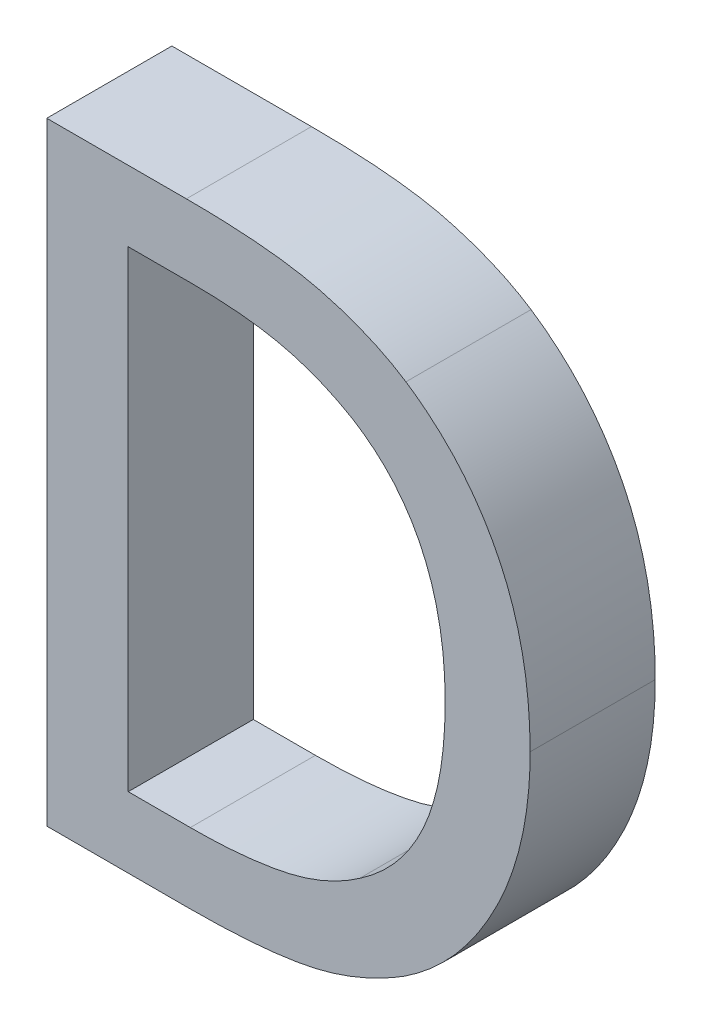
ISO-10303-21;
HEADER;
FILE_DESCRIPTION(('STEP AP214'),'2;1');
FILE_NAME('part.step','',(''),(''),'','','');
FILE_SCHEMA(('AUTOMOTIVE_DESIGN { 1 0 10303 214 1 1 1 1 }'));
ENDSEC;
DATA;
#1=APPLICATION_CONTEXT('core data for automotive mechanical design processes');
#2=APPLICATION_PROTOCOL_DEFINITION('international standard','automotive_design',2000,#1);
#3=PRODUCT_CONTEXT('',#1,'mechanical');
#4=PRODUCT('Part','Part','',(#3));
#5=PRODUCT_RELATED_PRODUCT_CATEGORY('part','',(#4));
#6=PRODUCT_DEFINITION_FORMATION('','',#4);
#7=PRODUCT_DEFINITION_CONTEXT('part definition',#1,'design');
#8=PRODUCT_DEFINITION('design','',#6,#7);
#9=PRODUCT_DEFINITION_SHAPE('','',#8);
#10=(LENGTH_UNIT() NAMED_UNIT(*) SI_UNIT(.MILLI.,.METRE.));
#11=(NAMED_UNIT(*) PLANE_ANGLE_UNIT() SI_UNIT($,.RADIAN.));
#12=(NAMED_UNIT(*) SI_UNIT($,.STERADIAN.) SOLID_ANGLE_UNIT());
#13=UNCERTAINTY_MEASURE_WITH_UNIT(LENGTH_MEASURE(1.E-05),#10,'distance_accuracy_value','');
#14=(GEOMETRIC_REPRESENTATION_CONTEXT(3) GLOBAL_UNCERTAINTY_ASSIGNED_CONTEXT((#13)) GLOBAL_UNIT_ASSIGNED_CONTEXT((#10,
#11,#12)) REPRESENTATION_CONTEXT('',''));
#15=CARTESIAN_POINT('',(0.,0.,0.));
#16=DIRECTION('',(0.,0.,1.));
#17=DIRECTION('',(1.,0.,0.));
#18=AXIS2_PLACEMENT_3D('',#15,#16,#17);
#19=CARTESIAN_POINT('',(-0.375230190296568,-1.23808482726,0.));
#20=CARTESIAN_POINT('',(-0.375230190296568,-1.23808482726,0.1));
#21=CARTESIAN_POINT('',(-0.34108108259972,-1.215054033697,0.));
#22=CARTESIAN_POINT('',(-0.34108108259972,-1.215054033697,0.1));
#23=CARTESIAN_POINT('',(-0.306931974902873,-1.13881416535,0.));
#24=CARTESIAN_POINT('',(-0.306931974902873,-1.13881416535,0.1));
#25=CARTESIAN_POINT('',(-0.306931974902873,-1.08163426409,0.));
#26=CARTESIAN_POINT('',(-0.306931974902873,-1.08163426409,0.1));
#27=B_SPLINE_SURFACE_WITH_KNOTS('',2,1,((#19,#20),(#21,#22),(#23,#24),(#25,#26)),.UNSPECIFIED.,
.F.,.F.,.F.,(3,1,3),(2,2),(0.,1.,2.),(0.,0.01),.UNSPECIFIED.);
#28=CARTESIAN_POINT('',(-0.375230190296568,-1.23808482726,0.));
#29=CARTESIAN_POINT('',(-0.34108108259972,-1.215054033697,0.));
#30=CARTESIAN_POINT('',(-0.306931974902873,-1.13881416535,0.));
#31=CARTESIAN_POINT('',(-0.306931974902873,-1.08163426409,0.));
#32=B_SPLINE_CURVE_WITH_KNOTS('',2,(#28,#29,#30,#31),.UNSPECIFIED.,.F.,.F.,(3,1,3),(0.,1.,2.),.UNSPECIFIED.);
#33=CARTESIAN_POINT('',(-0.375230190296568,-1.23808482726,0.));
#34=VERTEX_POINT('',#33);
#35=CARTESIAN_POINT('',(-0.306931974902873,-1.08163426409,0.));
#36=VERTEX_POINT('',#35);
#37=EDGE_CURVE('E11',#34,#36,#32,.T.);
#38=DIRECTION('',(0.,0.,1.));
#39=VECTOR('',#38,1.);
#40=CARTESIAN_POINT('',(-0.375230190296568,-1.23808482726,0.));
#41=LINE('',#40,#39);
#42=CARTESIAN_POINT('',(-0.375230190296568,-1.23808482726,0.1));
#43=VERTEX_POINT('',#42);
#44=EDGE_CURVE('E28',#34,#43,#41,.T.);
#45=CARTESIAN_POINT('',(-0.306931974902873,-1.08163426409,0.1));
#46=CARTESIAN_POINT('',(-0.306931974902873,-1.13881416535,0.1));
#47=CARTESIAN_POINT('',(-0.34108108259972,-1.215054033697,0.1));
#48=CARTESIAN_POINT('',(-0.375230190296568,-1.23808482726,0.1));
#49=B_SPLINE_CURVE_WITH_KNOTS('',2,(#45,#46,#47,#48),.UNSPECIFIED.,.F.,.F.,(3,1,3),(-2.,-1.,0.),.UNSPECIFIED.);
#50=CARTESIAN_POINT('',(-0.306931974902873,-1.08163426409,0.1));
#51=VERTEX_POINT('',#50);
#52=EDGE_CURVE('E305',#51,#43,#49,.T.);
#53=DIRECTION('',(0.,0.,1.));
#54=VECTOR('',#53,1.);
#55=CARTESIAN_POINT('',(-0.306931974902873,-1.08163426409,0.));
#56=LINE('',#55,#54);
#57=EDGE_CURVE('E41',#36,#51,#56,.T.);
#58=ORIENTED_EDGE('',*,*,#37,.F.);
#59=ORIENTED_EDGE('',*,*,#44,.T.);
#60=ORIENTED_EDGE('',*,*,#52,.F.);
#61=ORIENTED_EDGE('',*,*,#57,.F.);
#62=EDGE_LOOP('',(#58,#59,#60,#61));
#63=FACE_BOUND('',#62,.T.);
#64=ADVANCED_FACE('F17',(#63),#27,.F.);
#65=CARTESIAN_POINT('',(-0.510635373141046,-1.270645604366,0.));
#66=CARTESIAN_POINT('',(-0.510635373141046,-1.270645604366,0.1));
#67=CARTESIAN_POINT('',(-0.467353364548529,-1.270645604366,0.));
#68=CARTESIAN_POINT('',(-0.467353364548529,-1.270645604366,0.1));
#69=CARTESIAN_POINT('',(-0.401834727688298,-1.256747711699,0.));
#70=CARTESIAN_POINT('',(-0.401834727688298,-1.256747711699,0.1));
#71=CARTESIAN_POINT('',(-0.375230190296568,-1.23808482726,0.));
#72=CARTESIAN_POINT('',(-0.375230190296568,-1.23808482726,0.1));
#73=B_SPLINE_SURFACE_WITH_KNOTS('',2,1,((#65,#66),(#67,#68),(#69,#70),(#71,#72)),.UNSPECIFIED.,
.F.,.F.,.F.,(3,1,3),(2,2),(0.,1.,2.),(0.,0.01),.UNSPECIFIED.);
#74=CARTESIAN_POINT('',(-0.510635373141046,-1.270645604366,0.));
#75=CARTESIAN_POINT('',(-0.467353364548529,-1.270645604366,0.));
#76=CARTESIAN_POINT('',(-0.401834727688298,-1.256747711699,0.));
#77=CARTESIAN_POINT('',(-0.375230190296568,-1.23808482726,0.));
#78=B_SPLINE_CURVE_WITH_KNOTS('',2,(#74,#75,#76,#77),.UNSPECIFIED.,.F.,.F.,(3,1,3),(0.,1.,2.),.UNSPECIFIED.);
#79=CARTESIAN_POINT('',(-0.510635373141046,-1.270645604366,0.));
#80=VERTEX_POINT('',#79);
#81=EDGE_CURVE('E296',#80,#34,#78,.T.);
#82=DIRECTION('',(0.,0.,1.));
#83=VECTOR('',#82,1.);
#84=CARTESIAN_POINT('',(-0.510635373141046,-1.270645604366,0.));
#85=LINE('',#84,#83);
#86=CARTESIAN_POINT('',(-0.510635373141046,-1.270645604366,0.1));
#87=VERTEX_POINT('',#86);
#88=EDGE_CURVE('E290',#80,#87,#85,.T.);
#89=CARTESIAN_POINT('',(-0.375230190296568,-1.23808482726,0.1));
#90=CARTESIAN_POINT('',(-0.401834727688298,-1.256747711699,0.1));
#91=CARTESIAN_POINT('',(-0.467353364548529,-1.270645604366,0.1));
#92=CARTESIAN_POINT('',(-0.510635373141046,-1.270645604366,0.1));
#93=B_SPLINE_CURVE_WITH_KNOTS('',2,(#89,#90,#91,#92),.UNSPECIFIED.,.F.,.F.,(3,1,3),(-2.,-1.,0.),.UNSPECIFIED.);
#94=EDGE_CURVE('E286',#43,#87,#93,.T.);
#95=ORIENTED_EDGE('',*,*,#81,.F.);
#96=ORIENTED_EDGE('',*,*,#88,.T.);
#97=ORIENTED_EDGE('',*,*,#94,.F.);
#98=ORIENTED_EDGE('',*,*,#44,.F.);
#99=EDGE_LOOP('',(#95,#96,#97,#98));
#100=FACE_BOUND('',#99,.T.);
#101=ADVANCED_FACE('F311',(#100),#73,.F.);
#102=CARTESIAN_POINT('',(-0.560270704095766,-1.270645604366,0.));
#103=DIRECTION('',(0.,-1.,0.));
#104=DIRECTION('',(1.,0.,0.));
#105=AXIS2_PLACEMENT_3D('',#102,#103,#104);
#106=PLANE('',#105);
#107=DIRECTION('',(1.,0.,0.));
#108=VECTOR('',#107,1.);
#109=CARTESIAN_POINT('',(-0.520641165546713,-1.270645604366,0.));
#110=LINE('',#109,#108);
#111=CARTESIAN_POINT('',(-0.560270704095766,-1.270645604366,0.));
#112=VERTEX_POINT('',#111);
#113=EDGE_CURVE('E283',#112,#80,#110,.T.);
#114=ORIENTED_EDGE('',*,*,#113,.F.);
#115=DIRECTION('',(0.,0.,1.));
#116=VECTOR('',#115,1.);
#117=CARTESIAN_POINT('',(-0.560270704095766,-1.270645604366,0.));
#118=LINE('',#117,#116);
#119=CARTESIAN_POINT('',(-0.560270704095766,-1.270645604366,0.1));
#120=VERTEX_POINT('',#119);
#121=EDGE_CURVE('E281',#112,#120,#118,.T.);
#122=ORIENTED_EDGE('',*,*,#121,.T.);
#123=DIRECTION('',(-1.,0.,0.));
#124=VECTOR('',#123,1.);
#125=CARTESIAN_POINT('',(-0.520641165546713,-1.270645604366,0.1));
#126=LINE('',#125,#124);
#127=EDGE_CURVE('E278',#87,#120,#126,.T.);
#128=ORIENTED_EDGE('',*,*,#127,.F.);
#129=ORIENTED_EDGE('',*,*,#88,.F.);
#130=EDGE_LOOP('',(#114,#122,#128,#129));
#131=FACE_BOUND('',#130,.T.);
#132=ADVANCED_FACE('F324',(#131),#106,.F.);
#133=CARTESIAN_POINT('',(-0.560270704095766,-0.893417089109979,0.));
#134=DIRECTION('',(-1.,0.,0.));
#135=DIRECTION('',(0.,-1.,0.));
#136=AXIS2_PLACEMENT_3D('',#133,#134,#135);
#137=PLANE('',#136);
#138=DIRECTION('',(0.,-1.,0.));
#139=VECTOR('',#138,1.);
#140=CARTESIAN_POINT('',(-0.560270704095766,-0.987668539051488,0.));
#141=LINE('',#140,#139);
#142=CARTESIAN_POINT('',(-0.560270704095766,-0.893417089109979,0.));
#143=VERTEX_POINT('',#142);
#144=EDGE_CURVE('E275',#143,#112,#141,.T.);
#145=ORIENTED_EDGE('',*,*,#144,.F.);
#146=DIRECTION('',(0.,0.,1.));
#147=VECTOR('',#146,1.);
#148=CARTESIAN_POINT('',(-0.560270704095766,-0.893417089109979,0.));
#149=LINE('',#148,#147);
#150=CARTESIAN_POINT('',(-0.560270704095766,-0.893417089109979,0.1));
#151=VERTEX_POINT('',#150);
#152=EDGE_CURVE('E273',#143,#151,#149,.T.);
#153=ORIENTED_EDGE('',*,*,#152,.T.);
#154=DIRECTION('',(0.,1.,0.));
#155=VECTOR('',#154,1.);
#156=CARTESIAN_POINT('',(-0.560270704095766,-0.987668539051488,0.1));
#157=LINE('',#156,#155);
#158=EDGE_CURVE('E270',#120,#151,#157,.T.);
#159=ORIENTED_EDGE('',*,*,#158,.F.);
#160=ORIENTED_EDGE('',*,*,#121,.F.);
#161=EDGE_LOOP('',(#145,#153,#159,#160));
#162=FACE_BOUND('',#161,.T.);
#163=ADVANCED_FACE('F326',(#162),#137,.F.);
#164=CARTESIAN_POINT('',(-0.510635373141046,-0.893417089109979,0.));
#165=DIRECTION('',(0.,1.,0.));
#166=DIRECTION('',(-1.,0.,0.));
#167=AXIS2_PLACEMENT_3D('',#164,#165,#166);
#168=PLANE('',#167);
#169=DIRECTION('',(-1.,0.,0.));
#170=VECTOR('',#169,1.);
#171=CARTESIAN_POINT('',(-0.495823500069353,-0.893417089109979,0.));
#172=LINE('',#171,#170);
#173=CARTESIAN_POINT('',(-0.510635373141046,-0.893417089109979,0.));
#174=VERTEX_POINT('',#173);
#175=EDGE_CURVE('E267',#174,#143,#172,.T.);
#176=ORIENTED_EDGE('',*,*,#175,.F.);
#177=DIRECTION('',(0.,0.,1.));
#178=VECTOR('',#177,1.);
#179=CARTESIAN_POINT('',(-0.510635373141046,-0.893417089109979,0.));
#180=LINE('',#179,#178);
#181=CARTESIAN_POINT('',(-0.510635373141046,-0.893417089109979,0.1));
#182=VERTEX_POINT('',#181);
#183=EDGE_CURVE('E265',#174,#182,#180,.T.);
#184=ORIENTED_EDGE('',*,*,#183,.T.);
#185=DIRECTION('',(1.,0.,0.));
#186=VECTOR('',#185,1.);
#187=CARTESIAN_POINT('',(-0.495823500069353,-0.893417089109979,0.1));
#188=LINE('',#187,#186);
#189=EDGE_CURVE('E259',#151,#182,#188,.T.);
#190=ORIENTED_EDGE('',*,*,#189,.F.);
#191=ORIENTED_EDGE('',*,*,#152,.F.);
#192=EDGE_LOOP('',(#176,#184,#190,#191));
#193=FACE_BOUND('',#192,.T.);
#194=ADVANCED_FACE('F330',(#193),#168,.F.);
#195=CARTESIAN_POINT('',(-0.381186430011134,-0.922801205035174,0.));
#196=CARTESIAN_POINT('',(-0.381186430011134,-0.922801205035174,0.1));
#197=CARTESIAN_POINT('',(-0.407393884755227,-0.907314981777301,0.));
#198=CARTESIAN_POINT('',(-0.407393884755227,-0.907314981777301,0.1));
#199=CARTESIAN_POINT('',(-0.466559199253254,-0.893417089109979,0.));
#200=CARTESIAN_POINT('',(-0.466559199253254,-0.893417089109979,0.1));
#201=CARTESIAN_POINT('',(-0.510635373141046,-0.893417089109979,0.));
#202=CARTESIAN_POINT('',(-0.510635373141046,-0.893417089109979,0.1));
#203=B_SPLINE_SURFACE_WITH_KNOTS('',2,1,((#195,#196),(#197,#198),(#199,#200),(#201,#202)),
.UNSPECIFIED.,.F.,.F.,.F.,(3,1,3),(2,2),(0.,1.,2.),(0.,0.01),.UNSPECIFIED.);
#204=CARTESIAN_POINT('',(-0.381186430011134,-0.922801205035174,0.));
#205=CARTESIAN_POINT('',(-0.407393884755227,-0.907314981777301,0.));
#206=CARTESIAN_POINT('',(-0.466559199253254,-0.893417089109979,0.));
#207=CARTESIAN_POINT('',(-0.510635373141046,-0.893417089109979,0.));
#208=B_SPLINE_CURVE_WITH_KNOTS('',2,(#204,#205,#206,#207),.UNSPECIFIED.,.F.,.F.,(3,1,3),(0.,1.,
2.),.UNSPECIFIED.);
#209=CARTESIAN_POINT('',(-0.381186430011134,-0.922801205035174,0.));
#210=VERTEX_POINT('',#209);
#211=EDGE_CURVE('E254',#210,#174,#208,.T.);
#212=DIRECTION('',(0.,0.,1.));
#213=VECTOR('',#212,1.);
#214=CARTESIAN_POINT('',(-0.381186430011134,-0.922801205035174,0.));
#215=LINE('',#214,#213);
#216=CARTESIAN_POINT('',(-0.381186430011134,-0.922801205035174,0.1));
#217=VERTEX_POINT('',#216);
#218=EDGE_CURVE('E248',#210,#217,#215,.T.);
#219=CARTESIAN_POINT('',(-0.510635373141046,-0.893417089109979,0.1));
#220=CARTESIAN_POINT('',(-0.466559199253254,-0.893417089109979,0.1));
#221=CARTESIAN_POINT('',(-0.407393884755227,-0.907314981777301,0.1));
#222=CARTESIAN_POINT('',(-0.381186430011134,-0.922801205035174,0.1));
#223=B_SPLINE_CURVE_WITH_KNOTS('',2,(#219,#220,#221,#222),.UNSPECIFIED.,.F.,.F.,(3,1,3),(-2.,
-1.,0.),.UNSPECIFIED.);
#224=EDGE_CURVE('E241',#182,#217,#223,.T.);
#225=ORIENTED_EDGE('',*,*,#211,.F.);
#226=ORIENTED_EDGE('',*,*,#218,.T.);
#227=ORIENTED_EDGE('',*,*,#224,.F.);
#228=ORIENTED_EDGE('',*,*,#183,.F.);
#229=EDGE_LOOP('',(#225,#226,#227,#228));
#230=FACE_BOUND('',#229,.T.);
#231=ADVANCED_FACE('F333',(#230),#203,.F.);
#232=CARTESIAN_POINT('',(-0.306931974902873,-1.08163426409,0.));
#233=CARTESIAN_POINT('',(-0.306931974902873,-1.08163426409,0.1));
#234=CARTESIAN_POINT('',(-0.306931974902873,-1.025248528126,0.));
#235=CARTESIAN_POINT('',(-0.306931974902873,-1.025248528126,0.1));
#236=CARTESIAN_POINT('',(-0.344257743780822,-0.945434915950526,0.));
#237=CARTESIAN_POINT('',(-0.344257743780822,-0.945434915950526,0.1));
#238=CARTESIAN_POINT('',(-0.381186430011134,-0.922801205035174,0.));
#239=CARTESIAN_POINT('',(-0.381186430011134,-0.922801205035174,0.1));
#240=B_SPLINE_SURFACE_WITH_KNOTS('',2,1,((#232,#233),(#234,#235),(#236,#237),(#238,#239)),
.UNSPECIFIED.,.F.,.F.,.F.,(3,1,3),(2,2),(0.,1.,2.),(0.,0.01),.UNSPECIFIED.);
#241=CARTESIAN_POINT('',(-0.306931974902873,-1.08163426409,0.));
#242=CARTESIAN_POINT('',(-0.306931974902873,-1.025248528126,0.));
#243=CARTESIAN_POINT('',(-0.344257743780822,-0.945434915950526,0.));
#244=CARTESIAN_POINT('',(-0.381186430011134,-0.922801205035174,0.));
#245=B_SPLINE_CURVE_WITH_KNOTS('',2,(#241,#242,#243,#244),.UNSPECIFIED.,.F.,.F.,(3,1,3),(0.,1.,
2.),.UNSPECIFIED.);
#246=EDGE_CURVE('E233',#36,#210,#245,.T.);
#247=CARTESIAN_POINT('',(-0.381186430011134,-0.922801205035174,0.1));
#248=CARTESIAN_POINT('',(-0.344257743780822,-0.945434915950526,0.1));
#249=CARTESIAN_POINT('',(-0.306931974902873,-1.025248528126,0.1));
#250=CARTESIAN_POINT('',(-0.306931974902873,-1.08163426409,0.1));
#251=B_SPLINE_CURVE_WITH_KNOTS('',2,(#247,#248,#249,#250),.UNSPECIFIED.,.F.,.F.,(3,1,3),(-2.,
-1.,0.),.UNSPECIFIED.);
#252=EDGE_CURVE('E225',#217,#51,#251,.T.);
#253=ORIENTED_EDGE('',*,*,#246,.F.);
#254=ORIENTED_EDGE('',*,*,#57,.T.);
#255=ORIENTED_EDGE('',*,*,#252,.F.);
#256=ORIENTED_EDGE('',*,*,#218,.F.);
#257=EDGE_LOOP('',(#253,#254,#255,#256));
#258=FACE_BOUND('',#257,.T.);
#259=ADVANCED_FACE('F318',(#258),#240,.F.);
#260=CARTESIAN_POINT('',(-0.512620786379234,-1.32703134033,0.));
#261=CARTESIAN_POINT('',(-0.512620786379234,-1.32703134033,0.1));
#262=CARTESIAN_POINT('',(-0.45305838923357,-1.32703134033,0.));
#263=CARTESIAN_POINT('',(-0.45305838923357,-1.32703134033,0.1));
#264=CARTESIAN_POINT('',(-0.376421438239481,-1.311148034425,0.));
#265=CARTESIAN_POINT('',(-0.376421438239481,-1.311148034425,0.1));
#266=CARTESIAN_POINT('',(-0.339095669361531,-1.287720158214,0.));
#267=CARTESIAN_POINT('',(-0.339095669361531,-1.287720158214,0.1));
#268=B_SPLINE_SURFACE_WITH_KNOTS('',2,1,((#260,#261),(#262,#263),(#264,#265),(#266,#267)),
.UNSPECIFIED.,.F.,.F.,.F.,(3,1,3),(2,2),(-2.,-1.,0.),(0.,0.01),.UNSPECIFIED.);
#269=CARTESIAN_POINT('',(-0.339095669361531,-1.287720158214,0.));
#270=CARTESIAN_POINT('',(-0.376421438239481,-1.311148034425,0.));
#271=CARTESIAN_POINT('',(-0.45305838923357,-1.32703134033,0.));
#272=CARTESIAN_POINT('',(-0.512620786379234,-1.32703134033,0.));
#273=B_SPLINE_CURVE_WITH_KNOTS('',2,(#269,#270,#271,#272),.UNSPECIFIED.,.F.,.F.,(3,1,3),(0.,1.,
2.),.UNSPECIFIED.);
#274=CARTESIAN_POINT('',(-0.339095669361531,-1.287720158214,0.));
#275=VERTEX_POINT('',#274);
#276=CARTESIAN_POINT('',(-0.512620786379234,-1.32703134033,0.));
#277=VERTEX_POINT('',#276);
#278=EDGE_CURVE('E221',#275,#277,#273,.T.);
#279=DIRECTION('',(0.,0.,1.));
#280=VECTOR('',#279,1.);
#281=CARTESIAN_POINT('',(-0.339095669361531,-1.287720158214,0.));
#282=LINE('',#281,#280);
#283=CARTESIAN_POINT('',(-0.339095669361531,-1.287720158214,0.1));
#284=VERTEX_POINT('',#283);
#285=EDGE_CURVE('E216',#275,#284,#282,.T.);
#286=CARTESIAN_POINT('',(-0.512620786379234,-1.32703134033,0.1));
#287=CARTESIAN_POINT('',(-0.45305838923357,-1.32703134033,0.1));
#288=CARTESIAN_POINT('',(-0.376421438239481,-1.311148034425,0.1));
#289=CARTESIAN_POINT('',(-0.339095669361531,-1.287720158214,0.1));
#290=B_SPLINE_CURVE_WITH_KNOTS('',2,(#286,#287,#288,#289),.UNSPECIFIED.,.F.,.F.,(3,1,3),(-2.,
-1.,0.),.UNSPECIFIED.);
#291=CARTESIAN_POINT('',(-0.512620786379234,-1.32703134033,0.1));
#292=VERTEX_POINT('',#291);
#293=EDGE_CURVE('E147',#292,#284,#290,.T.);
#294=DIRECTION('',(0.,0.,1.));
#295=VECTOR('',#294,1.);
#296=CARTESIAN_POINT('',(-0.512620786379234,-1.32703134033,0.));
#297=LINE('',#296,#295);
#298=EDGE_CURVE('E210',#277,#292,#297,.T.);
#299=ORIENTED_EDGE('',*,*,#278,.F.);
#300=ORIENTED_EDGE('',*,*,#285,.T.);
#301=ORIENTED_EDGE('',*,*,#293,.F.);
#302=ORIENTED_EDGE('',*,*,#298,.F.);
#303=EDGE_LOOP('',(#299,#300,#301,#302));
#304=FACE_BOUND('',#303,.T.);
#305=ADVANCED_FACE('F341',(#304),#268,.T.);
#306=CARTESIAN_POINT('',(-0.62539225830836,-1.32703134033,0.));
#307=DIRECTION('',(0.,-1.,0.));
#308=DIRECTION('',(1.,0.,0.));
#309=AXIS2_PLACEMENT_3D('',#306,#307,#308);
#310=PLANE('',#309);
#311=DIRECTION('',(-1.,0.,0.));
#312=VECTOR('',#311,1.);
#313=CARTESIAN_POINT('',(-0.512620786379234,-1.32703134033,0.));
#314=LINE('',#313,#312);
#315=CARTESIAN_POINT('',(-0.62539225830836,-1.32703134033,0.));
#316=VERTEX_POINT('',#315);
#317=EDGE_CURVE('E208',#277,#316,#314,.T.);
#318=ORIENTED_EDGE('',*,*,#317,.F.);
#319=ORIENTED_EDGE('',*,*,#298,.T.);
#320=DIRECTION('',(1.,0.,0.));
#321=VECTOR('',#320,1.);
#322=CARTESIAN_POINT('',(-0.512620786379234,-1.32703134033,0.1));
#323=LINE('',#322,#321);
#324=CARTESIAN_POINT('',(-0.62539225830836,-1.32703134033,0.1));
#325=VERTEX_POINT('',#324);
#326=EDGE_CURVE('E206',#325,#292,#323,.T.);
#327=ORIENTED_EDGE('',*,*,#326,.F.);
#328=DIRECTION('',(0.,0.,1.));
#329=VECTOR('',#328,1.);
#330=CARTESIAN_POINT('',(-0.62539225830836,-1.32703134033,0.));
#331=LINE('',#330,#329);
#332=EDGE_CURVE('E203',#316,#325,#331,.T.);
#333=ORIENTED_EDGE('',*,*,#332,.F.);
#334=EDGE_LOOP('',(#318,#319,#327,#333));
#335=FACE_BOUND('',#334,.T.);
#336=ADVANCED_FACE('F398',(#335),#310,.T.);
#337=CARTESIAN_POINT('',(-0.62539225830836,-0.837031353145417,0.));
#338=DIRECTION('',(-1.,0.,0.));
#339=DIRECTION('',(0.,-1.,0.));
#340=AXIS2_PLACEMENT_3D('',#337,#338,#339);
#341=PLANE('',#340);
#342=DIRECTION('',(0.,1.,0.));
#343=VECTOR('',#342,1.);
#344=CARTESIAN_POINT('',(-0.62539225830836,-1.32703134033,0.));
#345=LINE('',#344,#343);
#346=CARTESIAN_POINT('',(-0.62539225830836,-0.837031353145417,0.));
#347=VERTEX_POINT('',#346);
#348=EDGE_CURVE('E201',#316,#347,#345,.T.);
#349=ORIENTED_EDGE('',*,*,#348,.F.);
#350=ORIENTED_EDGE('',*,*,#332,.T.);
#351=DIRECTION('',(0.,-1.,0.));
#352=VECTOR('',#351,1.);
#353=CARTESIAN_POINT('',(-0.62539225830836,-1.32703134033,0.1));
#354=LINE('',#353,#352);
#355=CARTESIAN_POINT('',(-0.62539225830836,-0.837031353145417,0.1));
#356=VERTEX_POINT('',#355);
#357=EDGE_CURVE('E198',#356,#325,#354,.T.);
#358=ORIENTED_EDGE('',*,*,#357,.F.);
#359=DIRECTION('',(0.,0.,1.));
#360=VECTOR('',#359,1.);
#361=CARTESIAN_POINT('',(-0.62539225830836,-0.837031353145417,0.));
#362=LINE('',#361,#360);
#363=EDGE_CURVE('E195',#347,#356,#362,.T.);
#364=ORIENTED_EDGE('',*,*,#363,.F.);
#365=EDGE_LOOP('',(#349,#350,#358,#364));
#366=FACE_BOUND('',#365,.T.);
#367=ADVANCED_FACE('F408',(#366),#341,.T.);
#368=CARTESIAN_POINT('',(-0.513812034322148,-0.837031353145417,0.));
#369=DIRECTION('',(0.,1.,0.));
#370=DIRECTION('',(-1.,0.,0.));
#371=AXIS2_PLACEMENT_3D('',#368,#369,#370);
#372=PLANE('',#371);
#373=DIRECTION('',(1.,0.,0.));
#374=VECTOR('',#373,1.);
#375=CARTESIAN_POINT('',(-0.62539225830836,-0.837031353145417,0.));
#376=LINE('',#375,#374);
#377=CARTESIAN_POINT('',(-0.513812034322148,-0.837031353145417,0.));
#378=VERTEX_POINT('',#377);
#379=EDGE_CURVE('E193',#347,#378,#376,.T.);
#380=ORIENTED_EDGE('',*,*,#379,.F.);
#381=ORIENTED_EDGE('',*,*,#363,.T.);
#382=DIRECTION('',(-1.,0.,0.));
#383=VECTOR('',#382,1.);
#384=CARTESIAN_POINT('',(-0.62539225830836,-0.837031353145417,0.1));
#385=LINE('',#384,#383);
#386=CARTESIAN_POINT('',(-0.513812034322148,-0.837031353145417,0.1));
#387=VERTEX_POINT('',#386);
#388=EDGE_CURVE('E190',#387,#356,#385,.T.);
#389=ORIENTED_EDGE('',*,*,#388,.F.);
#390=DIRECTION('',(0.,0.,1.));
#391=VECTOR('',#390,1.);
#392=CARTESIAN_POINT('',(-0.513812034322148,-0.837031353145417,0.));
#393=LINE('',#392,#391);
#394=EDGE_CURVE('E184',#378,#387,#393,.T.);
#395=ORIENTED_EDGE('',*,*,#394,.F.);
#396=EDGE_LOOP('',(#380,#381,#389,#395));
#397=FACE_BOUND('',#396,.T.);
#398=ADVANCED_FACE('F418',(#397),#372,.T.);
#399=CARTESIAN_POINT('',(-0.338301504066256,-0.875945452613917,0.));
#400=CARTESIAN_POINT('',(-0.338301504066256,-0.875945452613917,0.1));
#401=CARTESIAN_POINT('',(-0.366097289400899,-0.85767965082258,0.));
#402=CARTESIAN_POINT('',(-0.366097289400899,-0.85767965082258,0.1));
#403=CARTESIAN_POINT('',(-0.444719653633177,-0.837031353145417,0.));
#404=CARTESIAN_POINT('',(-0.444719653633177,-0.837031353145417,0.1));
#405=CARTESIAN_POINT('',(-0.513812034322148,-0.837031353145417,0.));
#406=CARTESIAN_POINT('',(-0.513812034322148,-0.837031353145417,0.1));
#407=B_SPLINE_SURFACE_WITH_KNOTS('',2,1,((#399,#400),(#401,#402),(#403,#404),(#405,#406)),
.UNSPECIFIED.,.F.,.F.,.F.,(3,1,3),(2,2),(-2.,-1.,0.),(0.,0.01),.UNSPECIFIED.);
#408=CARTESIAN_POINT('',(-0.513812034322148,-0.837031353145417,0.));
#409=CARTESIAN_POINT('',(-0.444719653633177,-0.837031353145417,0.));
#410=CARTESIAN_POINT('',(-0.366097289400899,-0.85767965082258,0.));
#411=CARTESIAN_POINT('',(-0.338301504066256,-0.875945452613917,0.));
#412=B_SPLINE_CURVE_WITH_KNOTS('',2,(#408,#409,#410,#411),.UNSPECIFIED.,.F.,.F.,(3,1,3),(0.,1.,
2.),.UNSPECIFIED.);
#413=CARTESIAN_POINT('',(-0.338301504066256,-0.875945452613917,0.));
#414=VERTEX_POINT('',#413);
#415=EDGE_CURVE('E177',#378,#414,#412,.T.);
#416=CARTESIAN_POINT('',(-0.338301504066256,-0.875945452613917,0.1));
#417=CARTESIAN_POINT('',(-0.366097289400899,-0.85767965082258,0.1));
#418=CARTESIAN_POINT('',(-0.444719653633177,-0.837031353145417,0.1));
#419=CARTESIAN_POINT('',(-0.513812034322148,-0.837031353145417,0.1));
#420=B_SPLINE_CURVE_WITH_KNOTS('',2,(#416,#417,#418,#419),.UNSPECIFIED.,.F.,.F.,(3,1,3),(-2.,
-1.,0.),.UNSPECIFIED.);
#421=CARTESIAN_POINT('',(-0.338301504066256,-0.875945452613917,0.1));
#422=VERTEX_POINT('',#421);
#423=EDGE_CURVE('E173',#422,#387,#420,.T.);
#424=DIRECTION('',(0.,0.,1.));
#425=VECTOR('',#424,1.);
#426=CARTESIAN_POINT('',(-0.338301504066256,-0.875945452613917,0.));
#427=LINE('',#426,#425);
#428=EDGE_CURVE('E129',#414,#422,#427,.T.);
#429=ORIENTED_EDGE('',*,*,#415,.F.);
#430=ORIENTED_EDGE('',*,*,#394,.T.);
#431=ORIENTED_EDGE('',*,*,#423,.F.);
#432=ORIENTED_EDGE('',*,*,#428,.F.);
#433=EDGE_LOOP('',(#429,#430,#431,#432));
#434=FACE_BOUND('',#433,.T.);
#435=ADVANCED_FACE('F428',(#434),#407,.T.);
#436=CARTESIAN_POINT('',(-0.239030842156815,-1.082428429386,0.));
#437=CARTESIAN_POINT('',(-0.239030842156815,-1.082428429386,0.1));
#438=CARTESIAN_POINT('',(-0.239030842156815,-1.010953552811,0.));
#439=CARTESIAN_POINT('',(-0.239030842156815,-1.010953552811,0.1));
#440=CARTESIAN_POINT('',(-0.291048668997362,-0.907314981777301,0.));
#441=CARTESIAN_POINT('',(-0.291048668997362,-0.907314981777301,0.1));
#442=CARTESIAN_POINT('',(-0.338301504066256,-0.875945452613917,0.));
#443=CARTESIAN_POINT('',(-0.338301504066256,-0.875945452613917,0.1));
#444=B_SPLINE_SURFACE_WITH_KNOTS('',2,1,((#436,#437),(#438,#439),(#440,#441),(#442,#443)),
.UNSPECIFIED.,.F.,.F.,.F.,(3,1,3),(2,2),(-2.,-1.,0.),(0.,0.01),.UNSPECIFIED.);
#445=CARTESIAN_POINT('',(-0.338301504066256,-0.875945452613917,0.));
#446=CARTESIAN_POINT('',(-0.291048668997362,-0.907314981777301,0.));
#447=CARTESIAN_POINT('',(-0.239030842156815,-1.010953552811,0.));
#448=CARTESIAN_POINT('',(-0.239030842156815,-1.082428429386,0.));
#449=B_SPLINE_CURVE_WITH_KNOTS('',2,(#445,#446,#447,#448),.UNSPECIFIED.,.F.,.F.,(3,1,3),(0.,1.,
2.),.UNSPECIFIED.);
#450=CARTESIAN_POINT('',(-0.239030842156815,-1.082428429386,0.));
#451=VERTEX_POINT('',#450);
#452=EDGE_CURVE('E133',#414,#451,#449,.T.);
#453=CARTESIAN_POINT('',(-0.239030842156815,-1.082428429386,0.1));
#454=CARTESIAN_POINT('',(-0.239030842156815,-1.010953552811,0.1));
#455=CARTESIAN_POINT('',(-0.291048668997362,-0.907314981777301,0.1));
#456=CARTESIAN_POINT('',(-0.338301504066256,-0.875945452613917,0.1));
#457=B_SPLINE_CURVE_WITH_KNOTS('',2,(#453,#454,#455,#456),.UNSPECIFIED.,.F.,.F.,(3,1,3),(-2.,
-1.,0.),.UNSPECIFIED.);
#458=CARTESIAN_POINT('',(-0.239030842156815,-1.082428429386,0.1));
#459=VERTEX_POINT('',#458);
#460=EDGE_CURVE('E122',#459,#422,#457,.T.);
#461=DIRECTION('',(0.,0.,1.));
#462=VECTOR('',#461,1.);
#463=CARTESIAN_POINT('',(-0.239030842156815,-1.082428429386,0.));
#464=LINE('',#463,#462);
#465=EDGE_CURVE('E126',#451,#459,#464,.T.);
#466=ORIENTED_EDGE('',*,*,#452,.F.);
#467=ORIENTED_EDGE('',*,*,#428,.T.);
#468=ORIENTED_EDGE('',*,*,#460,.F.);
#469=ORIENTED_EDGE('',*,*,#465,.F.);
#470=EDGE_LOOP('',(#466,#467,#468,#469));
#471=FACE_BOUND('',#470,.T.);
#472=ADVANCED_FACE('F125',(#471),#444,.T.);
#473=CARTESIAN_POINT('',(-0.339095669361531,-1.287720158214,0.));
#474=CARTESIAN_POINT('',(-0.339095669361531,-1.287720158214,0.1));
#475=CARTESIAN_POINT('',(-0.293431164883188,-1.257541876994,0.));
#476=CARTESIAN_POINT('',(-0.293431164883188,-1.257541876994,0.1));
#477=CARTESIAN_POINT('',(-0.239030842156815,-1.149535396836,0.));
#478=CARTESIAN_POINT('',(-0.239030842156815,-1.149535396836,0.1));
#479=CARTESIAN_POINT('',(-0.239030842156815,-1.082428429386,0.));
#480=CARTESIAN_POINT('',(-0.239030842156815,-1.082428429386,0.1));
#481=B_SPLINE_SURFACE_WITH_KNOTS('',2,1,((#473,#474),(#475,#476),(#477,#478),(#479,#480)),
.UNSPECIFIED.,.F.,.F.,.F.,(3,1,3),(2,2),(-2.,-1.,0.),(0.,0.01),.UNSPECIFIED.);
#482=CARTESIAN_POINT('',(-0.239030842156815,-1.082428429386,0.));
#483=CARTESIAN_POINT('',(-0.239030842156815,-1.149535396836,0.));
#484=CARTESIAN_POINT('',(-0.293431164883188,-1.257541876994,0.));
#485=CARTESIAN_POINT('',(-0.339095669361531,-1.287720158214,0.));
#486=B_SPLINE_CURVE_WITH_KNOTS('',2,(#482,#483,#484,#485),.UNSPECIFIED.,.F.,.F.,(3,1,3),(0.,1.,
2.),.UNSPECIFIED.);
#487=EDGE_CURVE('E141',#451,#275,#486,.T.);
#488=CARTESIAN_POINT('',(-0.339095669361531,-1.287720158214,0.1));
#489=CARTESIAN_POINT('',(-0.293431164883188,-1.257541876994,0.1));
#490=CARTESIAN_POINT('',(-0.239030842156815,-1.149535396836,0.1));
#491=CARTESIAN_POINT('',(-0.239030842156815,-1.082428429386,0.1));
#492=B_SPLINE_CURVE_WITH_KNOTS('',2,(#488,#489,#490,#491),.UNSPECIFIED.,.F.,.F.,(3,1,3),(-2.,
-1.,0.),.UNSPECIFIED.);
#493=EDGE_CURVE('E139',#284,#459,#492,.T.);
#494=ORIENTED_EDGE('',*,*,#487,.F.);
#495=ORIENTED_EDGE('',*,*,#465,.T.);
#496=ORIENTED_EDGE('',*,*,#493,.F.);
#497=ORIENTED_EDGE('',*,*,#285,.F.);
#498=EDGE_LOOP('',(#494,#495,#496,#497));
#499=FACE_BOUND('',#498,.T.);
#500=ADVANCED_FACE('F137',(#499),#481,.T.);
#501=CARTESIAN_POINT('',(-0.481011626997659,-1.081919988993,0.));
#502=DIRECTION('',(0.,0.,1.));
#503=DIRECTION('',(1.,0.,0.));
#504=AXIS2_PLACEMENT_3D('',#501,#502,#503);
#505=PLANE('',#504);
#506=ORIENTED_EDGE('',*,*,#487,.T.);
#507=ORIENTED_EDGE('',*,*,#278,.T.);
#508=ORIENTED_EDGE('',*,*,#317,.T.);
#509=ORIENTED_EDGE('',*,*,#348,.T.);
#510=ORIENTED_EDGE('',*,*,#379,.T.);
#511=ORIENTED_EDGE('',*,*,#415,.T.);
#512=ORIENTED_EDGE('',*,*,#452,.T.);
#513=EDGE_LOOP('',(#506,#507,#508,#509,#510,#511,#512));
#514=FACE_BOUND('',#513,.T.);
#515=ORIENTED_EDGE('',*,*,#37,.T.);
#516=ORIENTED_EDGE('',*,*,#246,.T.);
#517=ORIENTED_EDGE('',*,*,#211,.T.);
#518=ORIENTED_EDGE('',*,*,#175,.T.);
#519=ORIENTED_EDGE('',*,*,#144,.T.);
#520=ORIENTED_EDGE('',*,*,#113,.T.);
#521=ORIENTED_EDGE('',*,*,#81,.T.);
#522=EDGE_LOOP('',(#515,#516,#517,#518,#519,#520,#521));
#523=FACE_BOUND('',#522,.T.);
#524=ADVANCED_FACE('F321',(#514,#523),#505,.F.);
#525=CARTESIAN_POINT('',(-0.481011626997659,-1.081919988993,0.1));
#526=DIRECTION('',(0.,0.,1.));
#527=DIRECTION('',(1.,0.,0.));
#528=AXIS2_PLACEMENT_3D('',#525,#526,#527);
#529=PLANE('',#528);
#530=ORIENTED_EDGE('',*,*,#493,.T.);
#531=ORIENTED_EDGE('',*,*,#460,.T.);
#532=ORIENTED_EDGE('',*,*,#423,.T.);
#533=ORIENTED_EDGE('',*,*,#388,.T.);
#534=ORIENTED_EDGE('',*,*,#357,.T.);
#535=ORIENTED_EDGE('',*,*,#326,.T.);
#536=ORIENTED_EDGE('',*,*,#293,.T.);
#537=EDGE_LOOP('',(#530,#531,#532,#533,#534,#535,#536));
#538=FACE_BOUND('',#537,.T.);
#539=ORIENTED_EDGE('',*,*,#52,.T.);
#540=ORIENTED_EDGE('',*,*,#94,.T.);
#541=ORIENTED_EDGE('',*,*,#127,.T.);
#542=ORIENTED_EDGE('',*,*,#158,.T.);
#543=ORIENTED_EDGE('',*,*,#189,.T.);
#544=ORIENTED_EDGE('',*,*,#224,.T.);
#545=ORIENTED_EDGE('',*,*,#252,.T.);
#546=EDGE_LOOP('',(#539,#540,#541,#542,#543,#544,#545));
#547=FACE_BOUND('',#546,.T.);
#548=ADVANCED_FACE('F144',(#538,#547),#529,.T.);
#549=CLOSED_SHELL('',(#64,#101,#132,#163,#194,#231,#259,#305,#336,#367,#398,#435,#472,#500,#524,#548));
#550=MANIFOLD_SOLID_BREP('B1',#549);
#551=ADVANCED_BREP_SHAPE_REPRESENTATION('',(#18,#550),#14);
#552=SHAPE_DEFINITION_REPRESENTATION(#9,#551);
ENDSEC;
END-ISO-10303-21;
